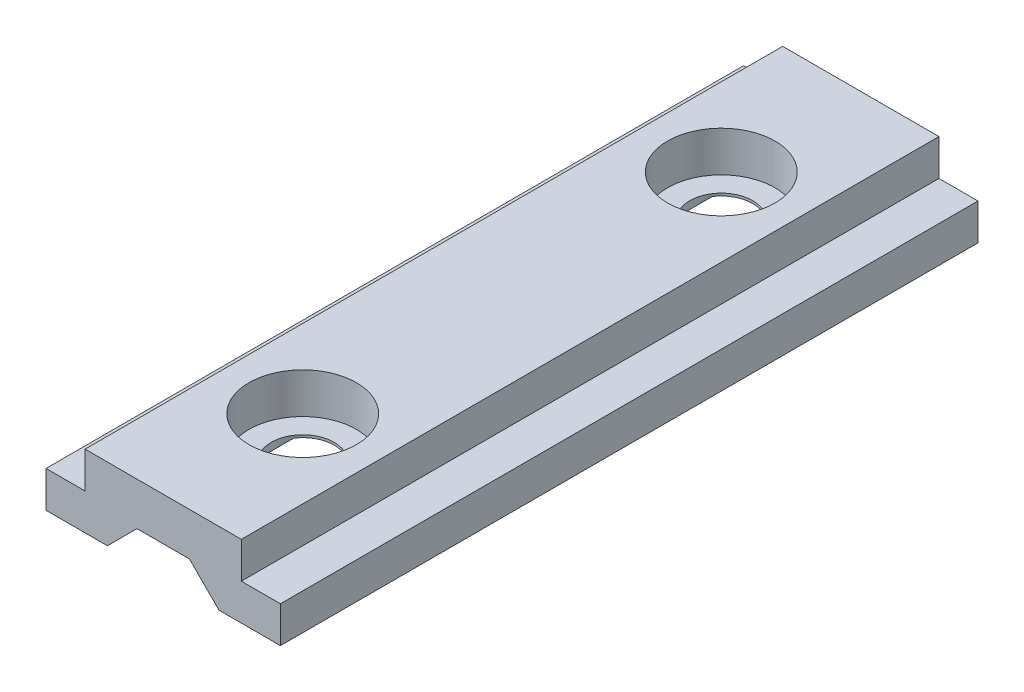
ISO-10303-21;
HEADER;
FILE_DESCRIPTION(('STEP AP214'),'2;1');
FILE_NAME('part.step','',(''),(''),'','','');
FILE_SCHEMA(('AUTOMOTIVE_DESIGN { 1 0 10303 214 1 1 1 1 }'));
ENDSEC;
DATA;
#1=APPLICATION_CONTEXT('core data for automotive mechanical design processes');
#2=APPLICATION_PROTOCOL_DEFINITION('international standard','automotive_design',2000,#1);
#3=PRODUCT_CONTEXT('',#1,'mechanical');
#4=PRODUCT('Part','Part','',(#3));
#5=PRODUCT_RELATED_PRODUCT_CATEGORY('part','',(#4));
#6=PRODUCT_DEFINITION_FORMATION('','',#4);
#7=PRODUCT_DEFINITION_CONTEXT('part definition',#1,'design');
#8=PRODUCT_DEFINITION('design','',#6,#7);
#9=PRODUCT_DEFINITION_SHAPE('','',#8);
#10=(LENGTH_UNIT() NAMED_UNIT(*) SI_UNIT(.MILLI.,.METRE.));
#11=(NAMED_UNIT(*) PLANE_ANGLE_UNIT() SI_UNIT($,.RADIAN.));
#12=(NAMED_UNIT(*) SI_UNIT($,.STERADIAN.) SOLID_ANGLE_UNIT());
#13=UNCERTAINTY_MEASURE_WITH_UNIT(LENGTH_MEASURE(1.E-05),#10,'distance_accuracy_value','');
#14=(GEOMETRIC_REPRESENTATION_CONTEXT(3) GLOBAL_UNCERTAINTY_ASSIGNED_CONTEXT((#13)) GLOBAL_UNIT_ASSIGNED_CONTEXT((#10,
#11,#12)) REPRESENTATION_CONTEXT('',''));
#15=CARTESIAN_POINT('',(0.,0.,0.));
#16=DIRECTION('',(0.,0.,1.));
#17=DIRECTION('',(1.,0.,0.));
#18=AXIS2_PLACEMENT_3D('',#15,#16,#17);
#19=CARTESIAN_POINT('',(6.52009833738849,2.12009833738849,50.));
#20=DIRECTION('',(0.,1.,0.));
#21=DIRECTION('',(-1.,0.,0.));
#22=AXIS2_PLACEMENT_3D('',#19,#20,#21);
#23=PLANE('',#22);
#24=DIRECTION('',(0.,0.,-1.));
#25=VECTOR('',#24,1.);
#26=CARTESIAN_POINT('',(6.52009833738849,2.12009833738849,50.));
#27=LINE('',#26,#25);
#28=CARTESIAN_POINT('',(6.52009833738849,2.12009833738849,38.7636870384444));
#29=VERTEX_POINT('',#28);
#30=CARTESIAN_POINT('',(6.52009833738849,2.12009833738849,11.2363129615556));
#31=VERTEX_POINT('',#30);
#32=EDGE_CURVE('E174',#29,#31,#27,.T.);
#33=ORIENTED_EDGE('',*,*,#32,.T.);
#34=CARTESIAN_POINT('',(8.4,2.12009833738849,10.));
#35=DIRECTION('',(0.,1.,0.));
#36=DIRECTION('',(-1.,0.,0.));
#37=AXIS2_PLACEMENT_3D('',#34,#35,#36);
#38=CIRCLE('',#37,2.25);
#39=CARTESIAN_POINT('',(10.2799016626115,2.12009833738849,11.2363129615557));
#40=VERTEX_POINT('',#39);
#41=EDGE_CURVE('E11',#31,#40,#38,.T.);
#42=ORIENTED_EDGE('',*,*,#41,.T.);
#43=DIRECTION('',(0.,0.,-1.));
#44=VECTOR('',#43,1.);
#45=CARTESIAN_POINT('',(10.2799016626115,2.12009833738849,50.));
#46=LINE('',#45,#44);
#47=CARTESIAN_POINT('',(10.2799016626115,2.12009833738849,38.7636870384444));
#48=VERTEX_POINT('',#47);
#49=EDGE_CURVE('E156',#48,#40,#46,.T.);
#50=ORIENTED_EDGE('',*,*,#49,.F.);
#51=CARTESIAN_POINT('',(8.4,2.12009833738849,40.));
#52=DIRECTION('',(0.,1.,0.));
#53=DIRECTION('',(-1.,0.,0.));
#54=AXIS2_PLACEMENT_3D('',#51,#52,#53);
#55=CIRCLE('',#54,2.25);
#56=EDGE_CURVE('E196',#48,#29,#55,.T.);
#57=ORIENTED_EDGE('',*,*,#56,.T.);
#58=EDGE_LOOP('',(#33,#42,#50,#57));
#59=FACE_BOUND('',#58,.T.);
#60=ADVANCED_FACE('F32',(#59),#23,.F.);
#61=CARTESIAN_POINT('',(6.52009833738849,2.12009833738849,50.));
#62=VERTEX_POINT('',#61);
#63=CARTESIAN_POINT('',(6.52009833738849,2.12009833738849,41.2363129615556));
#64=VERTEX_POINT('',#63);
#65=EDGE_CURVE('E175',#62,#64,#27,.T.);
#66=ORIENTED_EDGE('',*,*,#65,.T.);
#67=CARTESIAN_POINT('',(10.2799016626115,2.12009833738849,41.2363129615557));
#68=VERTEX_POINT('',#67);
#69=EDGE_CURVE('E55',#64,#68,#55,.T.);
#70=ORIENTED_EDGE('',*,*,#69,.T.);
#71=CARTESIAN_POINT('',(10.2799016626115,2.12009833738849,50.));
#72=VERTEX_POINT('',#71);
#73=EDGE_CURVE('E165',#72,#68,#46,.T.);
#74=ORIENTED_EDGE('',*,*,#73,.F.);
#75=DIRECTION('',(1.,0.,0.));
#76=VECTOR('',#75,1.);
#77=CARTESIAN_POINT('',(6.52009833738849,2.12009833738849,50.));
#78=LINE('',#77,#76);
#79=EDGE_CURVE('E216',#62,#72,#78,.T.);
#80=ORIENTED_EDGE('',*,*,#79,.F.);
#81=EDGE_LOOP('',(#66,#70,#74,#80));
#82=FACE_BOUND('',#81,.T.);
#83=ADVANCED_FACE('F346',(#82),#23,.F.);
#84=CARTESIAN_POINT('',(0.,2.6,50.));
#85=DIRECTION('',(1.,0.,0.));
#86=DIRECTION('',(0.,0.,-1.));
#87=AXIS2_PLACEMENT_3D('',#84,#85,#86);
#88=PLANE('',#87);
#89=DIRECTION('',(0.,-1.,0.));
#90=VECTOR('',#89,1.);
#91=CARTESIAN_POINT('',(0.,2.6,0.));
#92=LINE('',#91,#90);
#93=CARTESIAN_POINT('',(0.,2.6,0.));
#94=VERTEX_POINT('',#93);
#95=CARTESIAN_POINT('',(0.,0.,0.));
#96=VERTEX_POINT('',#95);
#97=EDGE_CURVE('E207',#94,#96,#92,.T.);
#98=ORIENTED_EDGE('',*,*,#97,.T.);
#99=DIRECTION('',(0.,0.,-1.));
#100=VECTOR('',#99,1.);
#101=CARTESIAN_POINT('',(0.,0.,50.));
#102=LINE('',#101,#100);
#103=CARTESIAN_POINT('',(0.,0.,50.));
#104=VERTEX_POINT('',#103);
#105=EDGE_CURVE('E185',#104,#96,#102,.T.);
#106=ORIENTED_EDGE('',*,*,#105,.F.);
#107=DIRECTION('',(0.,-1.,0.));
#108=VECTOR('',#107,1.);
#109=CARTESIAN_POINT('',(0.,2.6,50.));
#110=LINE('',#109,#108);
#111=CARTESIAN_POINT('',(0.,2.6,50.));
#112=VERTEX_POINT('',#111);
#113=EDGE_CURVE('E208',#112,#104,#110,.T.);
#114=ORIENTED_EDGE('',*,*,#113,.F.);
#115=DIRECTION('',(0.,0.,-1.));
#116=VECTOR('',#115,1.);
#117=CARTESIAN_POINT('',(0.,2.6,50.));
#118=LINE('',#117,#116);
#119=EDGE_CURVE('E234',#112,#94,#118,.T.);
#120=ORIENTED_EDGE('',*,*,#119,.T.);
#121=EDGE_LOOP('',(#98,#106,#114,#120));
#122=FACE_BOUND('',#121,.T.);
#123=ADVANCED_FACE('F34',(#122),#88,.F.);
#124=CARTESIAN_POINT('',(0.,0.,50.));
#125=DIRECTION('',(0.,1.,0.));
#126=DIRECTION('',(0.,0.,1.));
#127=AXIS2_PLACEMENT_3D('',#124,#125,#126);
#128=PLANE('',#127);
#129=DIRECTION('',(1.,0.,0.));
#130=VECTOR('',#129,1.);
#131=CARTESIAN_POINT('',(0.,0.,0.));
#132=LINE('',#131,#130);
#133=CARTESIAN_POINT('',(4.4,0.,0.));
#134=VERTEX_POINT('',#133);
#135=EDGE_CURVE('E237',#96,#134,#132,.T.);
#136=ORIENTED_EDGE('',*,*,#135,.T.);
#137=DIRECTION('',(0.,0.,-1.));
#138=VECTOR('',#137,1.);
#139=CARTESIAN_POINT('',(4.4,0.,50.));
#140=LINE('',#139,#138);
#141=CARTESIAN_POINT('',(4.4,0.,50.));
#142=VERTEX_POINT('',#141);
#143=EDGE_CURVE('E180',#142,#134,#140,.T.);
#144=ORIENTED_EDGE('',*,*,#143,.F.);
#145=DIRECTION('',(1.,0.,0.));
#146=VECTOR('',#145,1.);
#147=CARTESIAN_POINT('',(0.,0.,50.));
#148=LINE('',#147,#146);
#149=EDGE_CURVE('E211',#104,#142,#148,.T.);
#150=ORIENTED_EDGE('',*,*,#149,.F.);
#151=ORIENTED_EDGE('',*,*,#105,.T.);
#152=EDGE_LOOP('',(#136,#144,#150,#151));
#153=FACE_BOUND('',#152,.T.);
#154=ADVANCED_FACE('F339',(#153),#128,.F.);
#155=CARTESIAN_POINT('',(4.4,0.,50.));
#156=DIRECTION('',(-0.707106781186548,0.707106781186547,0.));
#157=DIRECTION('',(-0.707106781186547,-0.707106781186548,0.));
#158=AXIS2_PLACEMENT_3D('',#155,#156,#157);
#159=PLANE('',#158);
#160=CARTESIAN_POINT('',(6.52009833738849,2.12009833738849,8.76368703844437));
#161=VERTEX_POINT('',#160);
#162=CARTESIAN_POINT('',(6.52009833738849,2.12009833738849,0.));
#163=VERTEX_POINT('',#162);
#164=EDGE_CURVE('E171',#161,#163,#27,.T.);
#165=ORIENTED_EDGE('',*,*,#164,.F.);
#166=CARTESIAN_POINT('',(8.4,4.00000000000001,10.));
#167=DIRECTION('',(-0.707106781186548,0.707106781186547,0.));
#168=DIRECTION('',(0.707106781186547,0.707106781186548,0.));
#169=AXIS2_PLACEMENT_3D('',#166,#167,#168);
#170=ELLIPSE('',#169,3.18198051533946,2.25);
#171=EDGE_CURVE('E47',#161,#31,#170,.T.);
#172=ORIENTED_EDGE('',*,*,#171,.T.);
#173=ORIENTED_EDGE('',*,*,#32,.F.);
#174=CARTESIAN_POINT('',(8.4,4.00000000000001,40.));
#175=DIRECTION('',(-0.707106781186548,0.707106781186547,0.));
#176=DIRECTION('',(0.707106781186547,0.707106781186548,0.));
#177=AXIS2_PLACEMENT_3D('',#174,#175,#176);
#178=ELLIPSE('',#177,3.18198051533946,2.25);
#179=EDGE_CURVE('E148',#29,#64,#178,.T.);
#180=ORIENTED_EDGE('',*,*,#179,.T.);
#181=ORIENTED_EDGE('',*,*,#65,.F.);
#182=DIRECTION('',(0.707106781186547,0.707106781186548,0.));
#183=VECTOR('',#182,1.);
#184=CARTESIAN_POINT('',(4.4,0.,50.));
#185=LINE('',#184,#183);
#186=EDGE_CURVE('E214',#142,#62,#185,.T.);
#187=ORIENTED_EDGE('',*,*,#186,.F.);
#188=ORIENTED_EDGE('',*,*,#143,.T.);
#189=DIRECTION('',(0.707106781186547,0.707106781186548,0.));
#190=VECTOR('',#189,1.);
#191=CARTESIAN_POINT('',(4.4,0.,0.));
#192=LINE('',#191,#190);
#193=EDGE_CURVE('E239',#134,#163,#192,.T.);
#194=ORIENTED_EDGE('',*,*,#193,.T.);
#195=EDGE_LOOP('',(#165,#172,#173,#180,#181,#187,#188,#194));
#196=FACE_BOUND('',#195,.T.);
#197=ADVANCED_FACE('F193',(#196),#159,.F.);
#198=CARTESIAN_POINT('',(10.2799016626115,2.12009833738849,8.76368703844435));
#199=VERTEX_POINT('',#198);
#200=CARTESIAN_POINT('',(10.2799016626115,2.12009833738849,0.));
#201=VERTEX_POINT('',#200);
#202=EDGE_CURVE('E152',#199,#201,#46,.T.);
#203=ORIENTED_EDGE('',*,*,#202,.F.);
#204=EDGE_CURVE('E36',#199,#161,#38,.T.);
#205=ORIENTED_EDGE('',*,*,#204,.T.);
#206=ORIENTED_EDGE('',*,*,#164,.T.);
#207=DIRECTION('',(1.,0.,0.));
#208=VECTOR('',#207,1.);
#209=CARTESIAN_POINT('',(6.52009833738849,2.12009833738849,0.));
#210=LINE('',#209,#208);
#211=EDGE_CURVE('E161',#163,#201,#210,.T.);
#212=ORIENTED_EDGE('',*,*,#211,.T.);
#213=EDGE_LOOP('',(#203,#205,#206,#212));
#214=FACE_BOUND('',#213,.T.);
#215=ADVANCED_FACE('F159',(#214),#23,.F.);
#216=CARTESIAN_POINT('',(10.2799016626115,2.12009833738849,50.));
#217=DIRECTION('',(0.707106781186548,0.707106781186548,0.));
#218=DIRECTION('',(-0.707106781186548,0.707106781186548,0.));
#219=AXIS2_PLACEMENT_3D('',#216,#217,#218);
#220=PLANE('',#219);
#221=ORIENTED_EDGE('',*,*,#49,.T.);
#222=CARTESIAN_POINT('',(8.4,4.,10.));
#223=DIRECTION('',(0.707106781186548,0.707106781186548,0.));
#224=DIRECTION('',(-0.707106781186548,0.707106781186548,0.));
#225=AXIS2_PLACEMENT_3D('',#222,#223,#224);
#226=ELLIPSE('',#225,3.18198051533946,2.25);
#227=EDGE_CURVE('E144',#40,#199,#226,.T.);
#228=ORIENTED_EDGE('',*,*,#227,.T.);
#229=ORIENTED_EDGE('',*,*,#202,.T.);
#230=DIRECTION('',(0.707106781186548,-0.707106781186548,0.));
#231=VECTOR('',#230,1.);
#232=CARTESIAN_POINT('',(10.2799016626115,2.12009833738849,0.));
#233=LINE('',#232,#231);
#234=CARTESIAN_POINT('',(12.4,0.,0.));
#235=VERTEX_POINT('',#234);
#236=EDGE_CURVE('E242',#201,#235,#233,.T.);
#237=ORIENTED_EDGE('',*,*,#236,.T.);
#238=DIRECTION('',(0.,0.,-1.));
#239=VECTOR('',#238,1.);
#240=CARTESIAN_POINT('',(12.4,0.,50.));
#241=LINE('',#240,#239);
#242=CARTESIAN_POINT('',(12.4,0.,50.));
#243=VERTEX_POINT('',#242);
#244=EDGE_CURVE('E163',#243,#235,#241,.T.);
#245=ORIENTED_EDGE('',*,*,#244,.F.);
#246=DIRECTION('',(0.707106781186548,-0.707106781186548,0.));
#247=VECTOR('',#246,1.);
#248=CARTESIAN_POINT('',(10.2799016626115,2.12009833738849,50.));
#249=LINE('',#248,#247);
#250=EDGE_CURVE('E218',#72,#243,#249,.T.);
#251=ORIENTED_EDGE('',*,*,#250,.F.);
#252=ORIENTED_EDGE('',*,*,#73,.T.);
#253=CARTESIAN_POINT('',(8.4,4.,40.));
#254=DIRECTION('',(0.707106781186548,0.707106781186548,0.));
#255=DIRECTION('',(-0.707106781186548,0.707106781186548,0.));
#256=AXIS2_PLACEMENT_3D('',#253,#254,#255);
#257=ELLIPSE('',#256,3.18198051533946,2.25);
#258=EDGE_CURVE('E200',#68,#48,#257,.T.);
#259=ORIENTED_EDGE('',*,*,#258,.T.);
#260=EDGE_LOOP('',(#221,#228,#229,#237,#245,#251,#252,#259));
#261=FACE_BOUND('',#260,.T.);
#262=ADVANCED_FACE('F151',(#261),#220,.F.);
#263=CARTESIAN_POINT('',(12.4,0.,50.));
#264=DIRECTION('',(0.,1.,0.));
#265=DIRECTION('',(0.,0.,1.));
#266=AXIS2_PLACEMENT_3D('',#263,#264,#265);
#267=PLANE('',#266);
#268=DIRECTION('',(1.,0.,0.));
#269=VECTOR('',#268,1.);
#270=CARTESIAN_POINT('',(12.4,0.,0.));
#271=LINE('',#270,#269);
#272=CARTESIAN_POINT('',(16.8,0.,0.));
#273=VERTEX_POINT('',#272);
#274=EDGE_CURVE('E244',#235,#273,#271,.T.);
#275=ORIENTED_EDGE('',*,*,#274,.T.);
#276=DIRECTION('',(0.,0.,-1.));
#277=VECTOR('',#276,1.);
#278=CARTESIAN_POINT('',(16.8,0.,50.));
#279=LINE('',#278,#277);
#280=CARTESIAN_POINT('',(16.8,0.,50.));
#281=VERTEX_POINT('',#280);
#282=EDGE_CURVE('E167',#281,#273,#279,.T.);
#283=ORIENTED_EDGE('',*,*,#282,.F.);
#284=DIRECTION('',(1.,0.,0.));
#285=VECTOR('',#284,1.);
#286=CARTESIAN_POINT('',(12.4,0.,50.));
#287=LINE('',#286,#285);
#288=EDGE_CURVE('E220',#243,#281,#287,.T.);
#289=ORIENTED_EDGE('',*,*,#288,.F.);
#290=ORIENTED_EDGE('',*,*,#244,.T.);
#291=EDGE_LOOP('',(#275,#283,#289,#290));
#292=FACE_BOUND('',#291,.T.);
#293=ADVANCED_FACE('F303',(#292),#267,.F.);
#294=CARTESIAN_POINT('',(16.8,0.,50.));
#295=DIRECTION('',(-1.,0.,0.));
#296=DIRECTION('',(0.,0.,1.));
#297=AXIS2_PLACEMENT_3D('',#294,#295,#296);
#298=PLANE('',#297);
#299=DIRECTION('',(0.,1.,0.));
#300=VECTOR('',#299,1.);
#301=CARTESIAN_POINT('',(16.8,0.,0.));
#302=LINE('',#301,#300);
#303=CARTESIAN_POINT('',(16.8,2.6,0.));
#304=VERTEX_POINT('',#303);
#305=EDGE_CURVE('E246',#273,#304,#302,.T.);
#306=ORIENTED_EDGE('',*,*,#305,.T.);
#307=DIRECTION('',(0.,0.,-1.));
#308=VECTOR('',#307,1.);
#309=CARTESIAN_POINT('',(16.8,2.6,50.));
#310=LINE('',#309,#308);
#311=CARTESIAN_POINT('',(16.8,2.6,50.));
#312=VERTEX_POINT('',#311);
#313=EDGE_CURVE('E271',#312,#304,#310,.T.);
#314=ORIENTED_EDGE('',*,*,#313,.F.);
#315=DIRECTION('',(0.,1.,0.));
#316=VECTOR('',#315,1.);
#317=CARTESIAN_POINT('',(16.8,0.,50.));
#318=LINE('',#317,#316);
#319=EDGE_CURVE('E222',#281,#312,#318,.T.);
#320=ORIENTED_EDGE('',*,*,#319,.F.);
#321=ORIENTED_EDGE('',*,*,#282,.T.);
#322=EDGE_LOOP('',(#306,#314,#320,#321));
#323=FACE_BOUND('',#322,.T.);
#324=ADVANCED_FACE('F279',(#323),#298,.F.);
#325=CARTESIAN_POINT('',(16.8,2.6,50.));
#326=DIRECTION('',(0.,-1.,0.));
#327=DIRECTION('',(1.,0.,0.));
#328=AXIS2_PLACEMENT_3D('',#325,#326,#327);
#329=PLANE('',#328);
#330=DIRECTION('',(-1.,0.,0.));
#331=VECTOR('',#330,1.);
#332=CARTESIAN_POINT('',(16.8,2.6,0.));
#333=LINE('',#332,#331);
#334=CARTESIAN_POINT('',(14.,2.6,0.));
#335=VERTEX_POINT('',#334);
#336=EDGE_CURVE('E248',#304,#335,#333,.T.);
#337=ORIENTED_EDGE('',*,*,#336,.T.);
#338=DIRECTION('',(0.,0.,-1.));
#339=VECTOR('',#338,1.);
#340=CARTESIAN_POINT('',(14.,2.6,50.));
#341=LINE('',#340,#339);
#342=CARTESIAN_POINT('',(14.,2.6,50.));
#343=VERTEX_POINT('',#342);
#344=EDGE_CURVE('E268',#343,#335,#341,.T.);
#345=ORIENTED_EDGE('',*,*,#344,.F.);
#346=DIRECTION('',(-1.,0.,0.));
#347=VECTOR('',#346,1.);
#348=CARTESIAN_POINT('',(16.8,2.6,50.));
#349=LINE('',#348,#347);
#350=EDGE_CURVE('E224',#312,#343,#349,.T.);
#351=ORIENTED_EDGE('',*,*,#350,.F.);
#352=ORIENTED_EDGE('',*,*,#313,.T.);
#353=EDGE_LOOP('',(#337,#345,#351,#352));
#354=FACE_BOUND('',#353,.T.);
#355=ADVANCED_FACE('F292',(#354),#329,.F.);
#356=CARTESIAN_POINT('',(14.,2.6,50.));
#357=DIRECTION('',(-1.,0.,0.));
#358=DIRECTION('',(0.,0.,1.));
#359=AXIS2_PLACEMENT_3D('',#356,#357,#358);
#360=PLANE('',#359);
#361=DIRECTION('',(0.,1.,0.));
#362=VECTOR('',#361,1.);
#363=CARTESIAN_POINT('',(14.,2.6,0.));
#364=LINE('',#363,#362);
#365=CARTESIAN_POINT('',(14.,5.2,0.));
#366=VERTEX_POINT('',#365);
#367=EDGE_CURVE('E250',#335,#366,#364,.T.);
#368=ORIENTED_EDGE('',*,*,#367,.T.);
#369=DIRECTION('',(0.,0.,-1.));
#370=VECTOR('',#369,1.);
#371=CARTESIAN_POINT('',(14.,5.2,50.));
#372=LINE('',#371,#370);
#373=CARTESIAN_POINT('',(14.,5.2,50.));
#374=VERTEX_POINT('',#373);
#375=EDGE_CURVE('E265',#374,#366,#372,.T.);
#376=ORIENTED_EDGE('',*,*,#375,.F.);
#377=DIRECTION('',(0.,1.,0.));
#378=VECTOR('',#377,1.);
#379=CARTESIAN_POINT('',(14.,2.6,50.));
#380=LINE('',#379,#378);
#381=EDGE_CURVE('E226',#343,#374,#380,.T.);
#382=ORIENTED_EDGE('',*,*,#381,.F.);
#383=ORIENTED_EDGE('',*,*,#344,.T.);
#384=EDGE_LOOP('',(#368,#376,#382,#383));
#385=FACE_BOUND('',#384,.T.);
#386=ADVANCED_FACE('F296',(#385),#360,.F.);
#387=CARTESIAN_POINT('',(14.,5.2,50.));
#388=DIRECTION('',(0.,-1.,0.));
#389=DIRECTION('',(1.,0.,0.));
#390=AXIS2_PLACEMENT_3D('',#387,#388,#389);
#391=PLANE('',#390);
#392=CARTESIAN_POINT('',(8.4,5.2,10.));
#393=DIRECTION('',(0.,1.,0.));
#394=DIRECTION('',(0.,0.,1.));
#395=AXIS2_PLACEMENT_3D('',#392,#393,#394);
#396=CIRCLE('',#395,3.85);
#397=CARTESIAN_POINT('',(8.4,5.2,13.85));
#398=VERTEX_POINT('',#397);
#399=EDGE_CURVE('E400',#398,#398,#396,.T.);
#400=ORIENTED_EDGE('',*,*,#399,.F.);
#401=EDGE_LOOP('',(#400));
#402=FACE_BOUND('',#401,.T.);
#403=CARTESIAN_POINT('',(8.4,5.2,40.));
#404=DIRECTION('',(0.,1.,0.));
#405=DIRECTION('',(0.,0.,1.));
#406=AXIS2_PLACEMENT_3D('',#403,#404,#405);
#407=CIRCLE('',#406,3.85);
#408=CARTESIAN_POINT('',(8.4,5.2,43.85));
#409=VERTEX_POINT('',#408);
#410=EDGE_CURVE('E304',#409,#409,#407,.T.);
#411=ORIENTED_EDGE('',*,*,#410,.F.);
#412=EDGE_LOOP('',(#411));
#413=FACE_BOUND('',#412,.T.);
#414=DIRECTION('',(-1.,0.,0.));
#415=VECTOR('',#414,1.);
#416=CARTESIAN_POINT('',(14.,5.2,0.));
#417=LINE('',#416,#415);
#418=CARTESIAN_POINT('',(2.8,5.2,0.));
#419=VERTEX_POINT('',#418);
#420=EDGE_CURVE('E252',#366,#419,#417,.T.);
#421=ORIENTED_EDGE('',*,*,#420,.T.);
#422=DIRECTION('',(0.,0.,-1.));
#423=VECTOR('',#422,1.);
#424=CARTESIAN_POINT('',(2.8,5.2,50.));
#425=LINE('',#424,#423);
#426=CARTESIAN_POINT('',(2.8,5.2,50.));
#427=VERTEX_POINT('',#426);
#428=EDGE_CURVE('E262',#427,#419,#425,.T.);
#429=ORIENTED_EDGE('',*,*,#428,.F.);
#430=DIRECTION('',(-1.,0.,0.));
#431=VECTOR('',#430,1.);
#432=CARTESIAN_POINT('',(14.,5.2,50.));
#433=LINE('',#432,#431);
#434=EDGE_CURVE('E228',#374,#427,#433,.T.);
#435=ORIENTED_EDGE('',*,*,#434,.F.);
#436=ORIENTED_EDGE('',*,*,#375,.T.);
#437=EDGE_LOOP('',(#421,#429,#435,#436));
#438=FACE_BOUND('',#437,.T.);
#439=ADVANCED_FACE('F320',(#402,#413,#438),#391,.F.);
#440=CARTESIAN_POINT('',(2.8,5.2,50.));
#441=DIRECTION('',(1.,0.,0.));
#442=DIRECTION('',(0.,0.,-1.));
#443=AXIS2_PLACEMENT_3D('',#440,#441,#442);
#444=PLANE('',#443);
#445=DIRECTION('',(0.,-1.,0.));
#446=VECTOR('',#445,1.);
#447=CARTESIAN_POINT('',(2.8,5.2,0.));
#448=LINE('',#447,#446);
#449=CARTESIAN_POINT('',(2.8,2.6,0.));
#450=VERTEX_POINT('',#449);
#451=EDGE_CURVE('E254',#419,#450,#448,.T.);
#452=ORIENTED_EDGE('',*,*,#451,.T.);
#453=DIRECTION('',(0.,0.,-1.));
#454=VECTOR('',#453,1.);
#455=CARTESIAN_POINT('',(2.8,2.6,50.));
#456=LINE('',#455,#454);
#457=CARTESIAN_POINT('',(2.8,2.6,50.));
#458=VERTEX_POINT('',#457);
#459=EDGE_CURVE('E259',#458,#450,#456,.T.);
#460=ORIENTED_EDGE('',*,*,#459,.F.);
#461=DIRECTION('',(0.,-1.,0.));
#462=VECTOR('',#461,1.);
#463=CARTESIAN_POINT('',(2.8,5.2,50.));
#464=LINE('',#463,#462);
#465=EDGE_CURVE('E230',#427,#458,#464,.T.);
#466=ORIENTED_EDGE('',*,*,#465,.F.);
#467=ORIENTED_EDGE('',*,*,#428,.T.);
#468=EDGE_LOOP('',(#452,#460,#466,#467));
#469=FACE_BOUND('',#468,.T.);
#470=ADVANCED_FACE('F323',(#469),#444,.F.);
#471=CARTESIAN_POINT('',(2.8,2.6,50.));
#472=DIRECTION('',(0.,-1.,0.));
#473=DIRECTION('',(1.,0.,0.));
#474=AXIS2_PLACEMENT_3D('',#471,#472,#473);
#475=PLANE('',#474);
#476=DIRECTION('',(-1.,0.,0.));
#477=VECTOR('',#476,1.);
#478=CARTESIAN_POINT('',(2.8,2.6,0.));
#479=LINE('',#478,#477);
#480=EDGE_CURVE('E212',#450,#94,#479,.T.);
#481=ORIENTED_EDGE('',*,*,#480,.T.);
#482=ORIENTED_EDGE('',*,*,#119,.F.);
#483=DIRECTION('',(-1.,0.,0.));
#484=VECTOR('',#483,1.);
#485=CARTESIAN_POINT('',(2.8,2.6,50.));
#486=LINE('',#485,#484);
#487=EDGE_CURVE('E232',#458,#112,#486,.T.);
#488=ORIENTED_EDGE('',*,*,#487,.F.);
#489=ORIENTED_EDGE('',*,*,#459,.T.);
#490=EDGE_LOOP('',(#481,#482,#488,#489));
#491=FACE_BOUND('',#490,.T.);
#492=ADVANCED_FACE('F333',(#491),#475,.F.);
#493=CARTESIAN_POINT('',(0.,0.,50.));
#494=DIRECTION('',(0.,0.,1.));
#495=DIRECTION('',(1.,0.,0.));
#496=AXIS2_PLACEMENT_3D('',#493,#494,#495);
#497=PLANE('',#496);
#498=ORIENTED_EDGE('',*,*,#113,.T.);
#499=ORIENTED_EDGE('',*,*,#149,.T.);
#500=ORIENTED_EDGE('',*,*,#186,.T.);
#501=ORIENTED_EDGE('',*,*,#79,.T.);
#502=ORIENTED_EDGE('',*,*,#250,.T.);
#503=ORIENTED_EDGE('',*,*,#288,.T.);
#504=ORIENTED_EDGE('',*,*,#319,.T.);
#505=ORIENTED_EDGE('',*,*,#350,.T.);
#506=ORIENTED_EDGE('',*,*,#381,.T.);
#507=ORIENTED_EDGE('',*,*,#434,.T.);
#508=ORIENTED_EDGE('',*,*,#465,.T.);
#509=ORIENTED_EDGE('',*,*,#487,.T.);
#510=EDGE_LOOP('',(#498,#499,#500,#501,#502,#503,#504,#505,#506,#507,#508,#509));
#511=FACE_BOUND('',#510,.T.);
#512=ADVANCED_FACE('F300',(#511),#497,.T.);
#513=CARTESIAN_POINT('',(0.,0.,0.));
#514=DIRECTION('',(0.,0.,1.));
#515=DIRECTION('',(1.,0.,0.));
#516=AXIS2_PLACEMENT_3D('',#513,#514,#515);
#517=PLANE('',#516);
#518=ORIENTED_EDGE('',*,*,#97,.F.);
#519=ORIENTED_EDGE('',*,*,#480,.F.);
#520=ORIENTED_EDGE('',*,*,#451,.F.);
#521=ORIENTED_EDGE('',*,*,#420,.F.);
#522=ORIENTED_EDGE('',*,*,#367,.F.);
#523=ORIENTED_EDGE('',*,*,#336,.F.);
#524=ORIENTED_EDGE('',*,*,#305,.F.);
#525=ORIENTED_EDGE('',*,*,#274,.F.);
#526=ORIENTED_EDGE('',*,*,#236,.F.);
#527=ORIENTED_EDGE('',*,*,#211,.F.);
#528=ORIENTED_EDGE('',*,*,#193,.F.);
#529=ORIENTED_EDGE('',*,*,#135,.F.);
#530=EDGE_LOOP('',(#518,#519,#520,#521,#522,#523,#524,#525,#526,#527,#528,#529));
#531=FACE_BOUND('',#530,.T.);
#532=ADVANCED_FACE('F287',(#531),#517,.F.);
#533=CARTESIAN_POINT('',(8.4,5.2,40.));
#534=DIRECTION('',(0.,1.,0.));
#535=DIRECTION('',(0.,0.,1.));
#536=AXIS2_PLACEMENT_3D('',#533,#534,#535);
#537=CYLINDRICAL_SURFACE('',#536,2.25);
#538=CARTESIAN_POINT('',(8.4,2.3,40.));
#539=DIRECTION('',(0.,1.,0.));
#540=DIRECTION('',(0.,0.,1.));
#541=AXIS2_PLACEMENT_3D('',#538,#539,#540);
#542=CIRCLE('',#541,2.25);
#543=CARTESIAN_POINT('',(8.4,2.3,42.25));
#544=VERTEX_POINT('',#543);
#545=EDGE_CURVE('E198',#544,#544,#542,.T.);
#546=ORIENTED_EDGE('',*,*,#545,.T.);
#547=EDGE_LOOP('',(#546));
#548=FACE_BOUND('',#547,.T.);
#549=ORIENTED_EDGE('',*,*,#69,.F.);
#550=ORIENTED_EDGE('',*,*,#179,.F.);
#551=ORIENTED_EDGE('',*,*,#56,.F.);
#552=ORIENTED_EDGE('',*,*,#258,.F.);
#553=EDGE_LOOP('',(#549,#550,#551,#552));
#554=FACE_BOUND('',#553,.T.);
#555=ADVANCED_FACE('F195',(#548,#554),#537,.F.);
#556=CARTESIAN_POINT('',(10.65,2.3,40.));
#557=DIRECTION('',(0.,-1.,0.));
#558=DIRECTION('',(0.,0.,-1.));
#559=AXIS2_PLACEMENT_3D('',#556,#557,#558);
#560=PLANE('',#559);
#561=ORIENTED_EDGE('',*,*,#545,.F.);
#562=EDGE_LOOP('',(#561));
#563=FACE_BOUND('',#562,.T.);
#564=CARTESIAN_POINT('',(8.4,2.3,40.));
#565=DIRECTION('',(0.,1.,0.));
#566=DIRECTION('',(0.,0.,1.));
#567=AXIS2_PLACEMENT_3D('',#564,#565,#566);
#568=CIRCLE('',#567,3.85);
#569=CARTESIAN_POINT('',(8.4,2.3,43.85));
#570=VERTEX_POINT('',#569);
#571=EDGE_CURVE('E202',#570,#570,#568,.T.);
#572=ORIENTED_EDGE('',*,*,#571,.T.);
#573=EDGE_LOOP('',(#572));
#574=FACE_BOUND('',#573,.T.);
#575=ADVANCED_FACE('F312',(#563,#574),#560,.F.);
#576=CARTESIAN_POINT('',(8.4,5.2,40.));
#577=DIRECTION('',(0.,1.,0.));
#578=DIRECTION('',(0.,0.,1.));
#579=AXIS2_PLACEMENT_3D('',#576,#577,#578);
#580=CYLINDRICAL_SURFACE('',#579,3.85);
#581=ORIENTED_EDGE('',*,*,#571,.F.);
#582=EDGE_LOOP('',(#581));
#583=FACE_BOUND('',#582,.T.);
#584=ORIENTED_EDGE('',*,*,#410,.T.);
#585=EDGE_LOOP('',(#584));
#586=FACE_BOUND('',#585,.T.);
#587=ADVANCED_FACE('F314',(#583,#586),#580,.F.);
#588=CARTESIAN_POINT('',(8.4,5.2,10.));
#589=DIRECTION('',(0.,1.,0.));
#590=DIRECTION('',(0.,0.,1.));
#591=AXIS2_PLACEMENT_3D('',#588,#589,#590);
#592=CYLINDRICAL_SURFACE('',#591,2.25);
#593=CARTESIAN_POINT('',(8.4,2.3,10.));
#594=DIRECTION('',(0.,1.,0.));
#595=DIRECTION('',(0.,0.,1.));
#596=AXIS2_PLACEMENT_3D('',#593,#594,#595);
#597=CIRCLE('',#596,2.25);
#598=CARTESIAN_POINT('',(8.4,2.3,12.25));
#599=VERTEX_POINT('',#598);
#600=EDGE_CURVE('E157',#599,#599,#597,.T.);
#601=ORIENTED_EDGE('',*,*,#600,.T.);
#602=EDGE_LOOP('',(#601));
#603=FACE_BOUND('',#602,.T.);
#604=ORIENTED_EDGE('',*,*,#171,.F.);
#605=ORIENTED_EDGE('',*,*,#204,.F.);
#606=ORIENTED_EDGE('',*,*,#227,.F.);
#607=ORIENTED_EDGE('',*,*,#41,.F.);
#608=EDGE_LOOP('',(#604,#605,#606,#607));
#609=FACE_BOUND('',#608,.T.);
#610=ADVANCED_FACE('F143',(#603,#609),#592,.F.);
#611=CARTESIAN_POINT('',(10.65,2.3,10.));
#612=DIRECTION('',(0.,-1.,0.));
#613=DIRECTION('',(0.,0.,-1.));
#614=AXIS2_PLACEMENT_3D('',#611,#612,#613);
#615=PLANE('',#614);
#616=ORIENTED_EDGE('',*,*,#600,.F.);
#617=EDGE_LOOP('',(#616));
#618=FACE_BOUND('',#617,.T.);
#619=CARTESIAN_POINT('',(8.4,2.3,10.));
#620=DIRECTION('',(0.,1.,0.));
#621=DIRECTION('',(0.,0.,1.));
#622=AXIS2_PLACEMENT_3D('',#619,#620,#621);
#623=CIRCLE('',#622,3.85);
#624=CARTESIAN_POINT('',(8.4,2.3,13.85));
#625=VERTEX_POINT('',#624);
#626=EDGE_CURVE('E397',#625,#625,#623,.T.);
#627=ORIENTED_EDGE('',*,*,#626,.T.);
#628=EDGE_LOOP('',(#627));
#629=FACE_BOUND('',#628,.T.);
#630=ADVANCED_FACE('F384',(#618,#629),#615,.F.);
#631=CARTESIAN_POINT('',(8.4,5.2,10.));
#632=DIRECTION('',(0.,1.,0.));
#633=DIRECTION('',(0.,0.,1.));
#634=AXIS2_PLACEMENT_3D('',#631,#632,#633);
#635=CYLINDRICAL_SURFACE('',#634,3.85);
#636=ORIENTED_EDGE('',*,*,#626,.F.);
#637=EDGE_LOOP('',(#636));
#638=FACE_BOUND('',#637,.T.);
#639=ORIENTED_EDGE('',*,*,#399,.T.);
#640=EDGE_LOOP('',(#639));
#641=FACE_BOUND('',#640,.T.);
#642=ADVANCED_FACE('F388',(#638,#641),#635,.F.);
#643=CLOSED_SHELL('',(#60,#83,#123,#154,#197,#215,#262,#293,#324,#355,#386,#439,#470,#492,#512,
#532,#555,#575,#587,#610,#630,#642));
#644=MANIFOLD_SOLID_BREP('B2',#643);
#645=ADVANCED_BREP_SHAPE_REPRESENTATION('',(#18,#644),#14);
#646=SHAPE_DEFINITION_REPRESENTATION(#9,#645);
ENDSEC;
END-ISO-10303-21;
